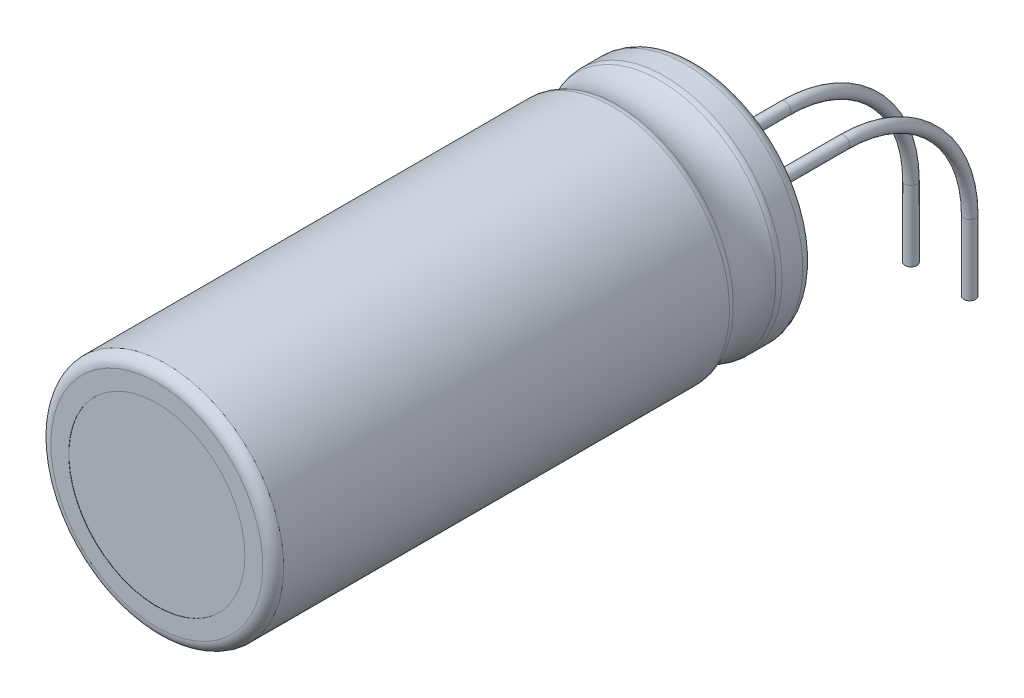
ISO-10303-21;
HEADER;
FILE_DESCRIPTION(('STEP AP214'),'2;1');
FILE_NAME('part.step','',(''),(''),'','','');
FILE_SCHEMA(('AUTOMOTIVE_DESIGN { 1 0 10303 214 1 1 1 1 }'));
ENDSEC;
DATA;
#1=APPLICATION_CONTEXT('core data for automotive mechanical design processes');
#2=APPLICATION_PROTOCOL_DEFINITION('international standard','automotive_design',2000,#1);
#3=PRODUCT_CONTEXT('',#1,'mechanical');
#4=PRODUCT('Part','Part','',(#3));
#5=PRODUCT_RELATED_PRODUCT_CATEGORY('part','',(#4));
#6=PRODUCT_DEFINITION_FORMATION('','',#4);
#7=PRODUCT_DEFINITION_CONTEXT('part definition',#1,'design');
#8=PRODUCT_DEFINITION('design','',#6,#7);
#9=PRODUCT_DEFINITION_SHAPE('','',#8);
#10=(LENGTH_UNIT() NAMED_UNIT(*) SI_UNIT(.MILLI.,.METRE.));
#11=(NAMED_UNIT(*) PLANE_ANGLE_UNIT() SI_UNIT($,.RADIAN.));
#12=(NAMED_UNIT(*) SI_UNIT($,.STERADIAN.) SOLID_ANGLE_UNIT());
#13=UNCERTAINTY_MEASURE_WITH_UNIT(LENGTH_MEASURE(1.E-05),#10,'distance_accuracy_value','');
#14=(GEOMETRIC_REPRESENTATION_CONTEXT(3) GLOBAL_UNCERTAINTY_ASSIGNED_CONTEXT((#13)) GLOBAL_UNIT_ASSIGNED_CONTEXT((#10,
#11,#12)) REPRESENTATION_CONTEXT('',''));
#15=CARTESIAN_POINT('',(0.,0.,0.));
#16=DIRECTION('',(0.,0.,1.));
#17=DIRECTION('',(1.,0.,0.));
#18=AXIS2_PLACEMENT_3D('',#15,#16,#17);
#19=CARTESIAN_POINT('',(0.,0.,23.));
#20=DIRECTION('',(0.,0.,-1.));
#21=DIRECTION('',(-1.,0.,0.));
#22=AXIS2_PLACEMENT_3D('',#19,#20,#21);
#23=CYLINDRICAL_SURFACE('',#22,5.);
#24=DIRECTION('',(0.,0.,1.));
#25=VECTOR('',#24,1.);
#26=CARTESIAN_POINT('',(-4.53153893518325,2.1130913087035,0.));
#27=LINE('',#26,#25);
#28=CARTESIAN_POINT('',(-4.53153893518325,2.1130913087035,0.5));
#29=VERTEX_POINT('',#28);
#30=CARTESIAN_POINT('',(-4.53153893518325,2.1130913087035,1.38196601124914));
#31=VERTEX_POINT('',#30);
#32=EDGE_CURVE('E188',#29,#31,#27,.T.);
#33=ORIENTED_EDGE('',*,*,#32,.T.);
#34=CARTESIAN_POINT('',(0.,0.,1.38196601124914));
#35=DIRECTION('',(0.,0.,1.));
#36=DIRECTION('',(1.,0.,0.));
#37=AXIS2_PLACEMENT_3D('',#34,#35,#36);
#38=CIRCLE('',#37,5.);
#39=CARTESIAN_POINT('',(-4.53153893518325,-2.1130913087035,1.38196601124914));
#40=VERTEX_POINT('',#39);
#41=EDGE_CURVE('E260',#31,#40,#38,.F.);
#42=ORIENTED_EDGE('',*,*,#41,.T.);
#43=DIRECTION('',(0.,0.,1.));
#44=VECTOR('',#43,1.);
#45=CARTESIAN_POINT('',(-4.53153893518325,-2.1130913087035,0.));
#46=LINE('',#45,#44);
#47=CARTESIAN_POINT('',(-4.53153893518325,-2.1130913087035,0.5));
#48=VERTEX_POINT('',#47);
#49=EDGE_CURVE('E200',#48,#40,#46,.T.);
#50=ORIENTED_EDGE('',*,*,#49,.F.);
#51=CARTESIAN_POINT('',(0.,0.,0.5));
#52=DIRECTION('',(0.,0.,1.));
#53=DIRECTION('',(1.,0.,0.));
#54=AXIS2_PLACEMENT_3D('',#51,#52,#53);
#55=CIRCLE('',#54,5.);
#56=EDGE_CURVE('E245',#48,#29,#55,.T.);
#57=ORIENTED_EDGE('',*,*,#56,.T.);
#58=EDGE_LOOP('',(#33,#42,#50,#57));
#59=FACE_BOUND('',#58,.T.);
#60=ADVANCED_FACE('F41',(#59),#23,.T.);
#61=CARTESIAN_POINT('',(0.,0.,0.));
#62=DIRECTION('',(0.,0.,-1.));
#63=DIRECTION('',(-1.,0.,0.));
#64=AXIS2_PLACEMENT_3D('',#61,#62,#63);
#65=CYLINDRICAL_SURFACE('',#64,5.01);
#66=DIRECTION('',(0.,0.,1.));
#67=VECTOR('',#66,1.);
#68=CARTESIAN_POINT('',(-4.54060201305361,2.11731749132091,0.));
#69=LINE('',#68,#67);
#70=CARTESIAN_POINT('',(-4.54060201305361,2.11731749132091,0.5));
#71=VERTEX_POINT('',#70);
#72=CARTESIAN_POINT('',(-4.54060201305361,2.11731749132091,1.40050125628935));
#73=VERTEX_POINT('',#72);
#74=EDGE_CURVE('E187',#71,#73,#69,.T.);
#75=ORIENTED_EDGE('',*,*,#74,.F.);
#76=CARTESIAN_POINT('',(0.,0.,0.5));
#77=DIRECTION('',(0.,0.,1.));
#78=DIRECTION('',(1.,0.,0.));
#79=AXIS2_PLACEMENT_3D('',#76,#77,#78);
#80=CIRCLE('',#79,5.01);
#81=CARTESIAN_POINT('',(-4.54060201305361,-2.11731749132091,0.5));
#82=VERTEX_POINT('',#81);
#83=EDGE_CURVE('E303',#71,#82,#80,.T.);
#84=ORIENTED_EDGE('',*,*,#83,.T.);
#85=DIRECTION('',(0.,0.,1.));
#86=VECTOR('',#85,1.);
#87=CARTESIAN_POINT('',(-4.54060201305361,-2.11731749132091,0.));
#88=LINE('',#87,#86);
#89=CARTESIAN_POINT('',(-4.54060201305361,-2.11731749132091,1.40050125628935));
#90=VERTEX_POINT('',#89);
#91=EDGE_CURVE('E199',#82,#90,#88,.T.);
#92=ORIENTED_EDGE('',*,*,#91,.T.);
#93=CARTESIAN_POINT('',(0.,0.,1.40050125628935));
#94=DIRECTION('',(0.,0.,1.));
#95=DIRECTION('',(1.,0.,0.));
#96=AXIS2_PLACEMENT_3D('',#93,#94,#95);
#97=CIRCLE('',#96,5.01);
#98=EDGE_CURVE('E299',#90,#73,#97,.F.);
#99=ORIENTED_EDGE('',*,*,#98,.T.);
#100=EDGE_LOOP('',(#75,#84,#92,#99));
#101=FACE_BOUND('',#100,.T.);
#102=ADVANCED_FACE('F351',(#101),#65,.T.);
#103=CARTESIAN_POINT('',(0.,0.,0.));
#104=DIRECTION('',(-0.4226182617407,0.90630778703665,0.));
#105=DIRECTION('',(0.,0.,1.));
#106=AXIS2_PLACEMENT_3D('',#103,#104,#105);
#107=PLANE('',#106);
#108=ORIENTED_EDGE('',*,*,#91,.F.);
#109=CARTESIAN_POINT('',(-4.08744811953529,-1.90600836045056,0.5));
#110=DIRECTION('',(-0.4226182617407,0.90630778703665,0.));
#111=DIRECTION('',(-0.90630778703665,-0.4226182617407,0.));
#112=AXIS2_PLACEMENT_3D('',#109,#110,#111);
#113=CIRCLE('',#112,0.5);
#114=CARTESIAN_POINT('',(-4.08744811953529,-1.90600836045056,0.));
#115=VERTEX_POINT('',#114);
#116=EDGE_CURVE('E309',#82,#115,#113,.F.);
#117=ORIENTED_EDGE('',*,*,#116,.T.);
#118=DIRECTION('',(-0.90630778703665,-0.4226182617407,0.));
#119=VECTOR('',#118,1.);
#120=CARTESIAN_POINT('',(-4.53153893518325,-2.1130913087035,0.));
#121=LINE('',#120,#119);
#122=CARTESIAN_POINT('',(-4.07838504166492,-1.90178217783315,0.));
#123=VERTEX_POINT('',#122);
#124=EDGE_CURVE('E192',#123,#115,#121,.T.);
#125=ORIENTED_EDGE('',*,*,#124,.F.);
#126=CARTESIAN_POINT('',(-4.07838504166492,-1.90178217783315,0.5));
#127=DIRECTION('',(-0.4226182617407,0.90630778703665,0.));
#128=DIRECTION('',(-0.90630778703665,-0.4226182617407,0.));
#129=AXIS2_PLACEMENT_3D('',#126,#127,#128);
#130=CIRCLE('',#129,0.5);
#131=EDGE_CURVE('E257',#123,#48,#130,.T.);
#132=ORIENTED_EDGE('',*,*,#131,.T.);
#133=ORIENTED_EDGE('',*,*,#49,.T.);
#134=CARTESIAN_POINT('',(-4.07838504166511,-1.90178217783324,1.38196601124914));
#135=DIRECTION('',(-0.4226182617407,0.90630778703665,0.));
#136=DIRECTION('',(-0.90630778703665,-0.4226182617407,0.));
#137=AXIS2_PLACEMENT_3D('',#134,#135,#136);
#138=CIRCLE('',#137,0.5);
#139=CARTESIAN_POINT('',(-4.48838142151513,-2.09296662957313,1.59492486624938));
#140=VERTEX_POINT('',#139);
#141=EDGE_CURVE('E276',#40,#140,#138,.T.);
#142=ORIENTED_EDGE('',*,*,#141,.T.);
#143=CARTESIAN_POINT('',(-6.23086603587696,-2.90550054946731,2.5));
#144=DIRECTION('',(-0.4226182617407,0.90630778703665,0.));
#145=DIRECTION('',(-0.90630778703665,-0.4226182617407,0.));
#146=AXIS2_PLACEMENT_3D('',#143,#144,#145);
#147=CIRCLE('',#146,2.125);
#148=CARTESIAN_POINT('',(-4.53153893518325,-2.1130913087035,1.5));
#149=VERTEX_POINT('',#148);
#150=EDGE_CURVE('E272',#149,#140,#147,.F.);
#151=ORIENTED_EDGE('',*,*,#150,.F.);
#152=CARTESIAN_POINT('',(-4.08744811953529,-1.90600836045056,1.40050125628935));
#153=DIRECTION('',(-0.4226182617407,0.90630778703665,0.));
#154=DIRECTION('',(-0.90630778703665,-0.4226182617407,0.));
#155=AXIS2_PLACEMENT_3D('',#152,#153,#154);
#156=CIRCLE('',#155,0.5);
#157=EDGE_CURVE('E306',#149,#90,#156,.F.);
#158=ORIENTED_EDGE('',*,*,#157,.T.);
#159=EDGE_LOOP('',(#108,#117,#125,#132,#133,#142,#151,#158));
#160=FACE_BOUND('',#159,.T.);
#161=ADVANCED_FACE('F360',(#160),#107,.F.);
#162=CARTESIAN_POINT('',(0.,0.,0.));
#163=DIRECTION('',(0.4226182617407,0.90630778703665,0.));
#164=DIRECTION('',(0.,0.,1.));
#165=AXIS2_PLACEMENT_3D('',#162,#163,#164);
#166=PLANE('',#165);
#167=DIRECTION('',(-0.90630778703665,0.4226182617407,0.));
#168=VECTOR('',#167,1.);
#169=CARTESIAN_POINT('',(-4.53153893518325,2.1130913087035,0.));
#170=LINE('',#169,#168);
#171=CARTESIAN_POINT('',(-4.07838504166492,1.90178217783315,0.));
#172=VERTEX_POINT('',#171);
#173=CARTESIAN_POINT('',(-4.08744811953529,1.90600836045056,0.));
#174=VERTEX_POINT('',#173);
#175=EDGE_CURVE('E173',#172,#174,#170,.T.);
#176=ORIENTED_EDGE('',*,*,#175,.T.);
#177=CARTESIAN_POINT('',(-4.08744811953529,1.90600836045056,0.5));
#178=DIRECTION('',(0.4226182617407,0.90630778703665,0.));
#179=DIRECTION('',(-0.90630778703665,0.4226182617407,0.));
#180=AXIS2_PLACEMENT_3D('',#177,#178,#179);
#181=CIRCLE('',#180,0.5);
#182=EDGE_CURVE('E296',#174,#71,#181,.T.);
#183=ORIENTED_EDGE('',*,*,#182,.T.);
#184=ORIENTED_EDGE('',*,*,#74,.T.);
#185=CARTESIAN_POINT('',(-4.08744811953529,1.90600836045056,1.40050125628935));
#186=DIRECTION('',(0.4226182617407,0.90630778703665,0.));
#187=DIRECTION('',(-0.90630778703665,0.4226182617407,0.));
#188=AXIS2_PLACEMENT_3D('',#185,#186,#187);
#189=CIRCLE('',#188,0.5);
#190=CARTESIAN_POINT('',(-4.53153893518324,2.1130913087035,1.5));
#191=VERTEX_POINT('',#190);
#192=EDGE_CURVE('E293',#73,#191,#189,.T.);
#193=ORIENTED_EDGE('',*,*,#192,.T.);
#194=CARTESIAN_POINT('',(-6.23086603587696,2.90550054946731,2.5));
#195=DIRECTION('',(0.4226182617407,0.90630778703665,0.));
#196=DIRECTION('',(-0.90630778703665,0.4226182617407,0.));
#197=AXIS2_PLACEMENT_3D('',#194,#195,#196);
#198=CIRCLE('',#197,2.125);
#199=CARTESIAN_POINT('',(-4.48838142151513,2.09296662957313,1.59492486624938));
#200=VERTEX_POINT('',#199);
#201=EDGE_CURVE('E264',#200,#191,#198,.T.);
#202=ORIENTED_EDGE('',*,*,#201,.F.);
#203=CARTESIAN_POINT('',(-4.07838504166511,1.90178217783324,1.38196601124914));
#204=DIRECTION('',(0.4226182617407,0.90630778703665,0.));
#205=DIRECTION('',(-0.90630778703665,0.4226182617407,0.));
#206=AXIS2_PLACEMENT_3D('',#203,#204,#205);
#207=CIRCLE('',#206,0.5);
#208=EDGE_CURVE('E279',#200,#31,#207,.F.);
#209=ORIENTED_EDGE('',*,*,#208,.T.);
#210=ORIENTED_EDGE('',*,*,#32,.F.);
#211=CARTESIAN_POINT('',(-4.07838504166492,1.90178217783315,0.5));
#212=DIRECTION('',(0.4226182617407,0.90630778703665,0.));
#213=DIRECTION('',(-0.90630778703665,0.4226182617407,0.));
#214=AXIS2_PLACEMENT_3D('',#211,#212,#213);
#215=CIRCLE('',#214,0.5);
#216=EDGE_CURVE('E253',#29,#172,#215,.F.);
#217=ORIENTED_EDGE('',*,*,#216,.T.);
#218=EDGE_LOOP('',(#176,#183,#184,#193,#202,#209,#210,#217));
#219=FACE_BOUND('',#218,.T.);
#220=ADVANCED_FACE('F348',(#219),#166,.T.);
#221=CARTESIAN_POINT('',(0.,0.,0.));
#222=DIRECTION('',(0.,0.,1.));
#223=DIRECTION('',(1.,0.,0.));
#224=AXIS2_PLACEMENT_3D('',#221,#222,#223);
#225=PLANE('',#224);
#226=CARTESIAN_POINT('',(-1.25,0.,0.));
#227=DIRECTION('',(0.,0.,1.));
#228=DIRECTION('',(1.,0.,0.));
#229=AXIS2_PLACEMENT_3D('',#226,#227,#228);
#230=CIRCLE('',#229,0.25);
#231=CARTESIAN_POINT('',(-1.,0.,0.));
#232=VERTEX_POINT('',#231);
#233=EDGE_CURVE('E241',#232,#232,#230,.F.);
#234=ORIENTED_EDGE('',*,*,#233,.F.);
#235=EDGE_LOOP('',(#234));
#236=FACE_BOUND('',#235,.T.);
#237=CARTESIAN_POINT('',(1.25,0.,0.));
#238=DIRECTION('',(0.,0.,1.));
#239=DIRECTION('',(1.,0.,0.));
#240=AXIS2_PLACEMENT_3D('',#237,#238,#239);
#241=CIRCLE('',#240,0.25);
#242=CARTESIAN_POINT('',(1.5,0.,0.));
#243=VERTEX_POINT('',#242);
#244=EDGE_CURVE('E237',#243,#243,#241,.F.);
#245=ORIENTED_EDGE('',*,*,#244,.F.);
#246=EDGE_LOOP('',(#245));
#247=FACE_BOUND('',#246,.T.);
#248=ORIENTED_EDGE('',*,*,#124,.T.);
#249=CARTESIAN_POINT('',(0.,0.,0.));
#250=DIRECTION('',(0.,0.,1.));
#251=DIRECTION('',(1.,0.,0.));
#252=AXIS2_PLACEMENT_3D('',#249,#250,#251);
#253=CIRCLE('',#252,4.51);
#254=EDGE_CURVE('E289',#115,#174,#253,.F.);
#255=ORIENTED_EDGE('',*,*,#254,.T.);
#256=ORIENTED_EDGE('',*,*,#175,.F.);
#257=CARTESIAN_POINT('',(0.,0.,0.));
#258=DIRECTION('',(0.,0.,1.));
#259=DIRECTION('',(1.,0.,0.));
#260=AXIS2_PLACEMENT_3D('',#257,#258,#259);
#261=CIRCLE('',#260,4.5);
#262=EDGE_CURVE('E249',#172,#123,#261,.F.);
#263=ORIENTED_EDGE('',*,*,#262,.T.);
#264=EDGE_LOOP('',(#248,#255,#256,#263));
#265=FACE_BOUND('',#264,.T.);
#266=ADVANCED_FACE('F362',(#236,#247,#265),#225,.F.);
#267=CARTESIAN_POINT('',(1.25,0.,-5.));
#268=DIRECTION('',(0.,0.,1.));
#269=DIRECTION('',(1.,0.,0.));
#270=AXIS2_PLACEMENT_3D('',#267,#268,#269);
#271=CYLINDRICAL_SURFACE('',#270,0.25);
#272=CARTESIAN_POINT('',(1.25,0.,-5.));
#273=DIRECTION('',(0.,0.,-1.));
#274=DIRECTION('',(-1.,0.,0.));
#275=AXIS2_PLACEMENT_3D('',#272,#273,#274);
#276=CIRCLE('',#275,0.25);
#277=CARTESIAN_POINT('',(1.25,0.25,-5.));
#278=VERTEX_POINT('',#277);
#279=EDGE_CURVE('E233',#278,#278,#276,.T.);
#280=ORIENTED_EDGE('',*,*,#279,.F.);
#281=EDGE_LOOP('',(#280));
#282=FACE_BOUND('',#281,.T.);
#283=ORIENTED_EDGE('',*,*,#244,.T.);
#284=EDGE_LOOP('',(#283));
#285=FACE_BOUND('',#284,.T.);
#286=ADVANCED_FACE('F446',(#282,#285),#271,.T.);
#287=CARTESIAN_POINT('',(-1.25,0.,-5.));
#288=DIRECTION('',(0.,0.,1.));
#289=DIRECTION('',(1.,0.,0.));
#290=AXIS2_PLACEMENT_3D('',#287,#288,#289);
#291=CYLINDRICAL_SURFACE('',#290,0.25);
#292=CARTESIAN_POINT('',(-1.25,0.,-5.));
#293=DIRECTION('',(0.,0.,-1.));
#294=DIRECTION('',(-1.,0.,0.));
#295=AXIS2_PLACEMENT_3D('',#292,#293,#294);
#296=CIRCLE('',#295,0.25);
#297=CARTESIAN_POINT('',(-1.25,0.25,-5.));
#298=VERTEX_POINT('',#297);
#299=EDGE_CURVE('E229',#298,#298,#296,.T.);
#300=ORIENTED_EDGE('',*,*,#299,.F.);
#301=EDGE_LOOP('',(#300));
#302=FACE_BOUND('',#301,.T.);
#303=ORIENTED_EDGE('',*,*,#233,.T.);
#304=EDGE_LOOP('',(#303));
#305=FACE_BOUND('',#304,.T.);
#306=ADVANCED_FACE('F442',(#302,#305),#291,.T.);
#307=CARTESIAN_POINT('',(1.25,-5.35829573508783,-5.));
#308=DIRECTION('',(1.,0.,0.));
#309=DIRECTION('',(0.,0.,-1.));
#310=AXIS2_PLACEMENT_3D('',#307,#308,#309);
#311=TOROIDAL_SURFACE('',#310,5.35829573508783,0.25);
#312=CARTESIAN_POINT('',(1.25,-5.35829573508785,-10.3582957350878));
#313=DIRECTION('',(0.,-1.,0.));
#314=DIRECTION('',(-1.,0.,0.));
#315=AXIS2_PLACEMENT_3D('',#312,#313,#314);
#316=CIRCLE('',#315,0.25);
#317=CARTESIAN_POINT('',(1.25,-5.35829573508785,-10.6082957350878));
#318=VERTEX_POINT('',#317);
#319=EDGE_CURVE('E225',#318,#318,#316,.T.);
#320=CARTESIAN_POINT('',(1.25,-5.35829573508783,-5.));
#321=DIRECTION('',(1.,0.,0.));
#322=DIRECTION('',(0.,0.,-1.));
#323=AXIS2_PLACEMENT_3D('',#320,#321,#322);
#324=CIRCLE('',#323,5.60829573508783);
#325=EDGE_CURVE('',#318,#278,#324,.T.);
#326=ORIENTED_EDGE('',*,*,#319,.F.);
#327=ORIENTED_EDGE('',*,*,#279,.T.);
#328=ORIENTED_EDGE('',*,*,#325,.T.);
#329=ORIENTED_EDGE('',*,*,#325,.F.);
#330=EDGE_LOOP('',(#326,#328,#327,#329));
#331=FACE_BOUND('',#330,.T.);
#332=ADVANCED_FACE('F438',(#331),#311,.T.);
#333=CARTESIAN_POINT('',(-1.25,-5.35829573508783,-5.));
#334=DIRECTION('',(1.,0.,0.));
#335=DIRECTION('',(0.,0.,-1.));
#336=AXIS2_PLACEMENT_3D('',#333,#334,#335);
#337=TOROIDAL_SURFACE('',#336,5.35829573508783,0.25);
#338=CARTESIAN_POINT('',(-1.25,-5.35829573508785,-10.3582957350878));
#339=DIRECTION('',(0.,-1.,0.));
#340=DIRECTION('',(-1.,0.,0.));
#341=AXIS2_PLACEMENT_3D('',#338,#339,#340);
#342=CIRCLE('',#341,0.25);
#343=CARTESIAN_POINT('',(-1.25,-5.35829573508785,-10.6082957350878));
#344=VERTEX_POINT('',#343);
#345=EDGE_CURVE('E221',#344,#344,#342,.T.);
#346=CARTESIAN_POINT('',(-1.25,-5.35829573508783,-5.));
#347=DIRECTION('',(1.,0.,0.));
#348=DIRECTION('',(0.,0.,-1.));
#349=AXIS2_PLACEMENT_3D('',#346,#347,#348);
#350=CIRCLE('',#349,5.60829573508783);
#351=EDGE_CURVE('',#344,#298,#350,.T.);
#352=ORIENTED_EDGE('',*,*,#345,.F.);
#353=ORIENTED_EDGE('',*,*,#299,.T.);
#354=ORIENTED_EDGE('',*,*,#351,.T.);
#355=ORIENTED_EDGE('',*,*,#351,.F.);
#356=EDGE_LOOP('',(#352,#354,#353,#355));
#357=FACE_BOUND('',#356,.T.);
#358=ADVANCED_FACE('F434',(#357),#337,.T.);
#359=CARTESIAN_POINT('',(1.25,-8.35829573508785,-10.3582957350878));
#360=DIRECTION('',(0.,1.,0.));
#361=DIRECTION('',(0.,0.,1.));
#362=AXIS2_PLACEMENT_3D('',#359,#360,#361);
#363=CYLINDRICAL_SURFACE('',#362,0.25);
#364=CARTESIAN_POINT('',(1.25,-8.35829573508785,-10.3582957350878));
#365=DIRECTION('',(0.,-1.,0.));
#366=DIRECTION('',(0.,0.,-1.));
#367=AXIS2_PLACEMENT_3D('',#364,#365,#366);
#368=CIRCLE('',#367,0.25);
#369=CARTESIAN_POINT('',(1.25,-8.35829573508785,-10.6082957350878));
#370=VERTEX_POINT('',#369);
#371=EDGE_CURVE('E217',#370,#370,#368,.T.);
#372=ORIENTED_EDGE('',*,*,#371,.F.);
#373=EDGE_LOOP('',(#372));
#374=FACE_BOUND('',#373,.T.);
#375=ORIENTED_EDGE('',*,*,#319,.T.);
#376=EDGE_LOOP('',(#375));
#377=FACE_BOUND('',#376,.T.);
#378=ADVANCED_FACE('F430',(#374,#377),#363,.T.);
#379=CARTESIAN_POINT('',(1.25,-8.35829573508785,-10.3582957350878));
#380=DIRECTION('',(0.,-1.,0.));
#381=DIRECTION('',(0.,0.,-1.));
#382=AXIS2_PLACEMENT_3D('',#379,#380,#381);
#383=PLANE('',#382);
#384=ORIENTED_EDGE('',*,*,#371,.T.);
#385=EDGE_LOOP('',(#384));
#386=FACE_BOUND('',#385,.T.);
#387=ADVANCED_FACE('F426',(#386),#383,.T.);
#388=CARTESIAN_POINT('',(-1.25,-8.35829573508785,-10.3582957350878));
#389=DIRECTION('',(0.,1.,0.));
#390=DIRECTION('',(0.,0.,1.));
#391=AXIS2_PLACEMENT_3D('',#388,#389,#390);
#392=CYLINDRICAL_SURFACE('',#391,0.25);
#393=CARTESIAN_POINT('',(-1.25,-8.35829573508785,-10.3582957350878));
#394=DIRECTION('',(0.,-1.,0.));
#395=DIRECTION('',(0.,0.,-1.));
#396=AXIS2_PLACEMENT_3D('',#393,#394,#395);
#397=CIRCLE('',#396,0.25);
#398=CARTESIAN_POINT('',(-1.25,-8.35829573508785,-10.6082957350878));
#399=VERTEX_POINT('',#398);
#400=EDGE_CURVE('E210',#399,#399,#397,.T.);
#401=ORIENTED_EDGE('',*,*,#400,.F.);
#402=EDGE_LOOP('',(#401));
#403=FACE_BOUND('',#402,.T.);
#404=ORIENTED_EDGE('',*,*,#345,.T.);
#405=EDGE_LOOP('',(#404));
#406=FACE_BOUND('',#405,.T.);
#407=ADVANCED_FACE('F422',(#403,#406),#392,.T.);
#408=CARTESIAN_POINT('',(-1.25,-8.35829573508785,-10.3582957350878));
#409=DIRECTION('',(0.,-1.,0.));
#410=DIRECTION('',(0.,0.,-1.));
#411=AXIS2_PLACEMENT_3D('',#408,#409,#410);
#412=PLANE('',#411);
#413=ORIENTED_EDGE('',*,*,#400,.T.);
#414=EDGE_LOOP('',(#413));
#415=FACE_BOUND('',#414,.T.);
#416=ADVANCED_FACE('F419',(#415),#412,.T.);
#417=CARTESIAN_POINT('',(0.,0.,2.5));
#418=DIRECTION('',(0.,0.,-1.));
#419=DIRECTION('',(-1.,0.,0.));
#420=AXIS2_PLACEMENT_3D('',#417,#418,#419);
#421=TOROIDAL_SURFACE('',#420,6.875,2.125);
#422=CARTESIAN_POINT('',(0.,0.,1.5));
#423=DIRECTION('',(0.,0.,-1.));
#424=DIRECTION('',(-1.,0.,0.));
#425=AXIS2_PLACEMENT_3D('',#422,#423,#424);
#426=CIRCLE('',#425,5.);
#427=EDGE_CURVE('E174',#149,#191,#426,.T.);
#428=ORIENTED_EDGE('',*,*,#427,.F.);
#429=ORIENTED_EDGE('',*,*,#150,.T.);
#430=CARTESIAN_POINT('',(0.,0.,1.59492486624938));
#431=DIRECTION('',(0.,0.,1.));
#432=DIRECTION('',(1.,0.,0.));
#433=AXIS2_PLACEMENT_3D('',#430,#431,#432);
#434=CIRCLE('',#433,4.95238095238128);
#435=EDGE_CURVE('E268',#140,#200,#434,.T.);
#436=ORIENTED_EDGE('',*,*,#435,.T.);
#437=ORIENTED_EDGE('',*,*,#201,.T.);
#438=EDGE_LOOP('',(#428,#429,#436,#437));
#439=FACE_BOUND('',#438,.T.);
#440=CARTESIAN_POINT('',(0.,0.,3.40507513375061));
#441=DIRECTION('',(0.,0.,-1.));
#442=DIRECTION('',(-1.,0.,0.));
#443=AXIS2_PLACEMENT_3D('',#440,#441,#442);
#444=CIRCLE('',#443,4.95238095238128);
#445=CARTESIAN_POINT('',(-4.48838142151513,2.09296662957313,3.40507513375061));
#446=VERTEX_POINT('',#445);
#447=CARTESIAN_POINT('',(-4.48838142151513,-2.09296662957313,3.40507513375061));
#448=VERTEX_POINT('',#447);
#449=EDGE_CURVE('E167',#446,#448,#444,.T.);
#450=ORIENTED_EDGE('',*,*,#449,.T.);
#451=CARTESIAN_POINT('',(-6.23086603587696,-2.90550054946731,2.5));
#452=DIRECTION('',(-0.4226182617407,0.90630778703665,0.));
#453=DIRECTION('',(-0.90630778703665,-0.4226182617407,0.));
#454=AXIS2_PLACEMENT_3D('',#451,#452,#453);
#455=CIRCLE('',#454,2.125);
#456=CARTESIAN_POINT('',(-4.53153893518325,-2.1130913087035,3.5));
#457=VERTEX_POINT('',#456);
#458=EDGE_CURVE('E148',#448,#457,#455,.F.);
#459=ORIENTED_EDGE('',*,*,#458,.T.);
#460=CARTESIAN_POINT('',(0.,0.,3.5));
#461=DIRECTION('',(0.,0.,-1.));
#462=DIRECTION('',(-1.,0.,0.));
#463=AXIS2_PLACEMENT_3D('',#460,#461,#462);
#464=CIRCLE('',#463,5.);
#465=CARTESIAN_POINT('',(-4.53153893518325,2.1130913087035,3.5));
#466=VERTEX_POINT('',#465);
#467=EDGE_CURVE('E164',#457,#466,#464,.T.);
#468=ORIENTED_EDGE('',*,*,#467,.T.);
#469=CARTESIAN_POINT('',(-6.23086603587696,2.90550054946731,2.5));
#470=DIRECTION('',(0.4226182617407,0.90630778703665,0.));
#471=DIRECTION('',(-0.90630778703665,0.4226182617407,0.));
#472=AXIS2_PLACEMENT_3D('',#469,#470,#471);
#473=CIRCLE('',#472,2.125);
#474=EDGE_CURVE('E282',#466,#446,#473,.T.);
#475=ORIENTED_EDGE('',*,*,#474,.T.);
#476=EDGE_LOOP('',(#450,#459,#468,#475));
#477=FACE_BOUND('',#476,.T.);
#478=ADVANCED_FACE('F162',(#439,#477),#421,.F.);
#479=CARTESIAN_POINT('',(0.,0.,22.99));
#480=DIRECTION('',(0.,0.,1.));
#481=DIRECTION('',(1.,0.,0.));
#482=AXIS2_PLACEMENT_3D('',#479,#480,#481);
#483=PLANE('',#482);
#484=CARTESIAN_POINT('',(0.,0.,22.99));
#485=DIRECTION('',(0.,0.,1.));
#486=DIRECTION('',(1.,0.,0.));
#487=AXIS2_PLACEMENT_3D('',#484,#485,#486);
#488=CIRCLE('',#487,3.75);
#489=CARTESIAN_POINT('',(3.75,0.,22.99));
#490=VERTEX_POINT('',#489);
#491=EDGE_CURVE('E206',#490,#490,#488,.T.);
#492=ORIENTED_EDGE('',*,*,#491,.T.);
#493=EDGE_LOOP('',(#492));
#494=FACE_BOUND('',#493,.T.);
#495=ADVANCED_FACE('F410',(#494),#483,.T.);
#496=CARTESIAN_POINT('',(0.,0.,22.99));
#497=DIRECTION('',(0.,0.,1.));
#498=DIRECTION('',(1.,0.,0.));
#499=AXIS2_PLACEMENT_3D('',#496,#497,#498);
#500=CYLINDRICAL_SURFACE('',#499,3.75);
#501=CARTESIAN_POINT('',(0.,0.,23.));
#502=DIRECTION('',(0.,0.,1.));
#503=DIRECTION('',(1.,0.,0.));
#504=AXIS2_PLACEMENT_3D('',#501,#502,#503);
#505=CIRCLE('',#504,3.75);
#506=CARTESIAN_POINT('',(3.75,0.,23.));
#507=VERTEX_POINT('',#506);
#508=EDGE_CURVE('E204',#507,#507,#505,.T.);
#509=CARTESIAN_POINT('',(3.75,0.,22.99));
#510=CARTESIAN_POINT('',(3.75,0.,22.9901041666667));
#511=CARTESIAN_POINT('',(3.75,0.,22.9902083333333));
#512=CARTESIAN_POINT('',(3.75,0.,22.9904166666667));
#513=CARTESIAN_POINT('',(3.75,0.,22.9905208333333));
#514=CARTESIAN_POINT('',(3.75,0.,22.9907291666667));
#515=CARTESIAN_POINT('',(3.75,0.,22.9908333333333));
#516=CARTESIAN_POINT('',(3.75,0.,22.9910416666667));
#517=CARTESIAN_POINT('',(3.75,0.,22.9911458333333));
#518=CARTESIAN_POINT('',(3.75,0.,22.9913541666667));
#519=CARTESIAN_POINT('',(3.75,0.,22.9914583333333));
#520=CARTESIAN_POINT('',(3.75,0.,22.9916666666667));
#521=CARTESIAN_POINT('',(3.75,0.,22.9917708333333));
#522=CARTESIAN_POINT('',(3.75,0.,22.9919791666667));
#523=CARTESIAN_POINT('',(3.75,0.,22.9920833333333));
#524=CARTESIAN_POINT('',(3.75,0.,22.9922916666667));
#525=CARTESIAN_POINT('',(3.75,0.,22.9923958333333));
#526=CARTESIAN_POINT('',(3.75,0.,22.9926041666667));
#527=CARTESIAN_POINT('',(3.75,0.,22.9927083333333));
#528=CARTESIAN_POINT('',(3.75,0.,22.9929166666667));
#529=CARTESIAN_POINT('',(3.75,0.,22.9930208333333));
#530=CARTESIAN_POINT('',(3.75,0.,22.9932291666667));
#531=CARTESIAN_POINT('',(3.75,0.,22.9933333333333));
#532=CARTESIAN_POINT('',(3.75,0.,22.9935416666667));
#533=CARTESIAN_POINT('',(3.75,0.,22.9936458333333));
#534=CARTESIAN_POINT('',(3.75,0.,22.9938541666667));
#535=CARTESIAN_POINT('',(3.75,0.,22.9939583333333));
#536=CARTESIAN_POINT('',(3.75,0.,22.9941666666667));
#537=CARTESIAN_POINT('',(3.75,0.,22.9942708333333));
#538=CARTESIAN_POINT('',(3.75,0.,22.9944791666667));
#539=CARTESIAN_POINT('',(3.75,0.,22.9945833333333));
#540=CARTESIAN_POINT('',(3.75,0.,22.9947916666667));
#541=CARTESIAN_POINT('',(3.75,0.,22.9948958333333));
#542=CARTESIAN_POINT('',(3.75,0.,22.9951041666667));
#543=CARTESIAN_POINT('',(3.75,0.,22.9952083333333));
#544=CARTESIAN_POINT('',(3.75,0.,22.9954166666667));
#545=CARTESIAN_POINT('',(3.75,0.,22.9955208333333));
#546=CARTESIAN_POINT('',(3.75,0.,22.9957291666667));
#547=CARTESIAN_POINT('',(3.75,0.,22.9958333333333));
#548=CARTESIAN_POINT('',(3.75,0.,22.9960416666667));
#549=CARTESIAN_POINT('',(3.75,0.,22.9961458333333));
#550=CARTESIAN_POINT('',(3.75,0.,22.9963541666667));
#551=CARTESIAN_POINT('',(3.75,0.,22.9964583333333));
#552=CARTESIAN_POINT('',(3.75,0.,22.9966666666667));
#553=CARTESIAN_POINT('',(3.75,0.,22.9967708333333));
#554=CARTESIAN_POINT('',(3.75,0.,22.9969791666667));
#555=CARTESIAN_POINT('',(3.75,0.,22.9970833333333));
#556=CARTESIAN_POINT('',(3.75,0.,22.9972916666667));
#557=CARTESIAN_POINT('',(3.75,0.,22.9973958333333));
#558=CARTESIAN_POINT('',(3.75,0.,22.9976041666667));
#559=CARTESIAN_POINT('',(3.75,0.,22.9977083333333));
#560=CARTESIAN_POINT('',(3.75,0.,22.9979166666667));
#561=CARTESIAN_POINT('',(3.75,0.,22.9980208333333));
#562=CARTESIAN_POINT('',(3.75,0.,22.9982291666667));
#563=CARTESIAN_POINT('',(3.75,0.,22.9983333333333));
#564=CARTESIAN_POINT('',(3.75,0.,22.9985416666667));
#565=CARTESIAN_POINT('',(3.75,0.,22.9986458333333));
#566=CARTESIAN_POINT('',(3.75,0.,22.9988541666667));
#567=CARTESIAN_POINT('',(3.75,0.,22.9989583333333));
#568=CARTESIAN_POINT('',(3.75,0.,22.9991666666667));
#569=CARTESIAN_POINT('',(3.75,0.,22.9992708333333));
#570=CARTESIAN_POINT('',(3.75,0.,22.9994791666667));
#571=CARTESIAN_POINT('',(3.75,0.,22.9995833333333));
#572=CARTESIAN_POINT('',(3.75,0.,22.9997916666667));
#573=CARTESIAN_POINT('',(3.75,0.,22.9998958333333));
#574=CARTESIAN_POINT('',(3.75,0.,23.));
#575=B_SPLINE_CURVE_WITH_KNOTS('',3,(#509,#510,#511,#512,#513,#514,#515,#516,#517,#518,#519,
#520,#521,#522,#523,#524,#525,#526,#527,#528,#529,#530,#531,#532,#533,#534,#535,#536,#537,#538,
#539,#540,#541,#542,#543,#544,#545,#546,#547,#548,#549,#550,#551,#552,#553,#554,#555,#556,#557,
#558,#559,#560,#561,#562,#563,#564,#565,#566,#567,#568,#569,#570,#571,#572,#573,#574),
.UNSPECIFIED.,.F.,.F.,(4,2,2,2,2,2,2,2,2,2,2,2,2,2,2,2,2,2,2,2,2,2,2,2,2,2,2,2,2,2,2,2,4),(0.,
0.000312500000002047,0.000625000000000625,0.000937500000002672,0.00125000000000125,
0.0015625000000033,0.00187500000000188,0.00218750000000045,0.0025000000000025,
0.00281250000000108,0.00312500000000313,0.0034375000000017,0.00375000000000028,
0.00406250000000233,0.00437500000000091,0.00468750000000295,0.00500000000000153,
0.00531250000000011,0.00562500000000216,0.00593750000000073,0.00625000000000278,
0.00656250000000136,0.00687499999999994,0.00718750000000198,0.00750000000000056,
0.00781250000000261,0.00812500000000119,0.00843749999999976,0.00875000000000181,
0.00906250000000039,0.00937500000000244,0.00968750000000101,0.00999999999999959),.UNSPECIFIED.);
#576=EDGE_CURVE('BSEAM413',#490,#507,#575,.T.);
#577=ORIENTED_EDGE('',*,*,#491,.F.);
#578=ORIENTED_EDGE('',*,*,#508,.T.);
#579=ORIENTED_EDGE('',*,*,#576,.T.);
#580=ORIENTED_EDGE('',*,*,#576,.F.);
#581=EDGE_LOOP('',(#577,#579,#578,#580));
#582=FACE_BOUND('',#581,.T.);
#583=ADVANCED_FACE('F413',(#582),#500,.F.);
#584=CARTESIAN_POINT('',(0.,0.,23.));
#585=DIRECTION('',(0.,0.,1.));
#586=DIRECTION('',(1.,0.,0.));
#587=AXIS2_PLACEMENT_3D('',#584,#585,#586);
#588=PLANE('',#587);
#589=CARTESIAN_POINT('',(0.,0.,23.));
#590=DIRECTION('',(0.,0.,1.));
#591=DIRECTION('',(1.,0.,0.));
#592=AXIS2_PLACEMENT_3D('',#589,#590,#591);
#593=CIRCLE('',#592,4.51);
#594=CARTESIAN_POINT('',(-4.08744811953528,-1.90600836045056,23.));
#595=VERTEX_POINT('',#594);
#596=EDGE_CURVE('E11',#595,#595,#593,.T.);
#597=ORIENTED_EDGE('',*,*,#596,.T.);
#598=EDGE_LOOP('',(#597));
#599=FACE_BOUND('',#598,.T.);
#600=ORIENTED_EDGE('',*,*,#508,.F.);
#601=EDGE_LOOP('',(#600));
#602=FACE_BOUND('',#601,.T.);
#603=ADVANCED_FACE('F417',(#599,#602),#588,.T.);
#604=CARTESIAN_POINT('',(-4.53153893518325,-2.1130913087035,3.61803398875085));
#605=VERTEX_POINT('',#604);
#606=CARTESIAN_POINT('',(-4.53153893518324,-2.1130913087035,22.5994987437107));
#607=VERTEX_POINT('',#606);
#608=EDGE_CURVE('E205',#605,#607,#46,.T.);
#609=ORIENTED_EDGE('',*,*,#608,.T.);
#610=CARTESIAN_POINT('',(-4.08744811953529,-1.90600836045056,22.5));
#611=DIRECTION('',(-0.4226182617407,0.90630778703665,0.));
#612=DIRECTION('',(-0.90630778703665,-0.4226182617407,0.));
#613=AXIS2_PLACEMENT_3D('',#610,#611,#612);
#614=CIRCLE('',#613,0.5);
#615=CARTESIAN_POINT('',(-4.54060201305361,-2.11731749132091,22.5));
#616=VERTEX_POINT('',#615);
#617=EDGE_CURVE('E50',#607,#616,#614,.F.);
#618=ORIENTED_EDGE('',*,*,#617,.T.);
#619=CARTESIAN_POINT('',(-4.54060201305361,-2.11731749132091,3.59949874371065));
#620=VERTEX_POINT('',#619);
#621=EDGE_CURVE('E151',#620,#616,#88,.T.);
#622=ORIENTED_EDGE('',*,*,#621,.F.);
#623=CARTESIAN_POINT('',(-4.08744811953529,-1.90600836045056,3.59949874371065));
#624=DIRECTION('',(-0.4226182617407,0.90630778703665,0.));
#625=DIRECTION('',(-0.90630778703665,-0.4226182617407,0.));
#626=AXIS2_PLACEMENT_3D('',#623,#624,#625);
#627=CIRCLE('',#626,0.5);
#628=EDGE_CURVE('E145',#620,#457,#627,.F.);
#629=ORIENTED_EDGE('',*,*,#628,.T.);
#630=ORIENTED_EDGE('',*,*,#458,.F.);
#631=CARTESIAN_POINT('',(-4.07838504166511,-1.90178217783324,3.61803398875085));
#632=DIRECTION('',(-0.4226182617407,0.90630778703665,0.));
#633=DIRECTION('',(-0.90630778703665,-0.4226182617407,0.));
#634=AXIS2_PLACEMENT_3D('',#631,#632,#633);
#635=CIRCLE('',#634,0.5);
#636=EDGE_CURVE('E316',#448,#605,#635,.T.);
#637=ORIENTED_EDGE('',*,*,#636,.T.);
#638=EDGE_LOOP('',(#609,#618,#622,#629,#630,#637));
#639=FACE_BOUND('',#638,.T.);
#640=ADVANCED_FACE('F147',(#639),#107,.F.);
#641=CARTESIAN_POINT('',(-4.54060201305361,2.11731749132091,3.59949874371065));
#642=VERTEX_POINT('',#641);
#643=CARTESIAN_POINT('',(-4.54060201305361,2.11731749132091,22.5));
#644=VERTEX_POINT('',#643);
#645=EDGE_CURVE('E179',#642,#644,#69,.T.);
#646=ORIENTED_EDGE('',*,*,#645,.T.);
#647=CARTESIAN_POINT('',(-4.08744811953529,1.90600836045056,22.5));
#648=DIRECTION('',(0.4226182617407,0.90630778703665,0.));
#649=DIRECTION('',(-0.90630778703665,0.4226182617407,0.));
#650=AXIS2_PLACEMENT_3D('',#647,#648,#649);
#651=CIRCLE('',#650,0.5);
#652=CARTESIAN_POINT('',(-4.53153893518324,2.1130913087035,22.5994987437107));
#653=VERTEX_POINT('',#652);
#654=EDGE_CURVE('E326',#644,#653,#651,.T.);
#655=ORIENTED_EDGE('',*,*,#654,.T.);
#656=CARTESIAN_POINT('',(-4.53153893518325,2.1130913087035,3.61803398875085));
#657=VERTEX_POINT('',#656);
#658=EDGE_CURVE('E193',#657,#653,#27,.T.);
#659=ORIENTED_EDGE('',*,*,#658,.F.);
#660=CARTESIAN_POINT('',(-4.07838504166511,1.90178217783324,3.61803398875085));
#661=DIRECTION('',(0.4226182617407,0.90630778703665,0.));
#662=DIRECTION('',(-0.90630778703665,0.4226182617407,0.));
#663=AXIS2_PLACEMENT_3D('',#660,#661,#662);
#664=CIRCLE('',#663,0.5);
#665=EDGE_CURVE('E319',#657,#446,#664,.F.);
#666=ORIENTED_EDGE('',*,*,#665,.T.);
#667=ORIENTED_EDGE('',*,*,#474,.F.);
#668=CARTESIAN_POINT('',(-4.08744811953529,1.90600836045056,3.59949874371065));
#669=DIRECTION('',(0.4226182617407,0.90630778703665,0.));
#670=DIRECTION('',(-0.90630778703665,0.4226182617407,0.));
#671=AXIS2_PLACEMENT_3D('',#668,#669,#670);
#672=CIRCLE('',#671,0.5);
#673=EDGE_CURVE('E157',#466,#642,#672,.T.);
#674=ORIENTED_EDGE('',*,*,#673,.T.);
#675=EDGE_LOOP('',(#646,#655,#659,#666,#667,#674));
#676=FACE_BOUND('',#675,.T.);
#677=ADVANCED_FACE('F339',(#676),#166,.T.);
#678=ORIENTED_EDGE('',*,*,#621,.T.);
#679=CARTESIAN_POINT('',(0.,0.,22.5));
#680=DIRECTION('',(0.,0.,1.));
#681=DIRECTION('',(1.,0.,0.));
#682=AXIS2_PLACEMENT_3D('',#679,#680,#681);
#683=CIRCLE('',#682,5.01);
#684=EDGE_CURVE('E322',#616,#644,#683,.F.);
#685=ORIENTED_EDGE('',*,*,#684,.T.);
#686=ORIENTED_EDGE('',*,*,#645,.F.);
#687=CARTESIAN_POINT('',(0.,0.,3.59949874371065));
#688=DIRECTION('',(0.,0.,-1.));
#689=DIRECTION('',(-1.,0.,0.));
#690=AXIS2_PLACEMENT_3D('',#687,#688,#689);
#691=CIRCLE('',#690,5.01);
#692=EDGE_CURVE('E158',#642,#620,#691,.F.);
#693=ORIENTED_EDGE('',*,*,#692,.T.);
#694=EDGE_LOOP('',(#678,#685,#686,#693));
#695=FACE_BOUND('',#694,.T.);
#696=ADVANCED_FACE('F335',(#695),#65,.T.);
#697=ORIENTED_EDGE('',*,*,#658,.T.);
#698=CARTESIAN_POINT('',(0.,0.,22.5994987437107));
#699=DIRECTION('',(0.,0.,-1.));
#700=DIRECTION('',(-1.,0.,0.));
#701=AXIS2_PLACEMENT_3D('',#698,#699,#700);
#702=CIRCLE('',#701,5.);
#703=EDGE_CURVE('E60',#653,#607,#702,.T.);
#704=ORIENTED_EDGE('',*,*,#703,.T.);
#705=ORIENTED_EDGE('',*,*,#608,.F.);
#706=CARTESIAN_POINT('',(0.,0.,3.61803398875085));
#707=DIRECTION('',(0.,0.,1.));
#708=DIRECTION('',(1.,0.,0.));
#709=AXIS2_PLACEMENT_3D('',#706,#707,#708);
#710=CIRCLE('',#709,5.);
#711=EDGE_CURVE('E169',#605,#657,#710,.T.);
#712=ORIENTED_EDGE('',*,*,#711,.T.);
#713=EDGE_LOOP('',(#697,#704,#705,#712));
#714=FACE_BOUND('',#713,.T.);
#715=ADVANCED_FACE('F341',(#714),#23,.T.);
#716=CARTESIAN_POINT('',(0.,0.,0.5));
#717=DIRECTION('',(0.,0.,1.));
#718=DIRECTION('',(1.,0.,0.));
#719=AXIS2_PLACEMENT_3D('',#716,#717,#718);
#720=TOROIDAL_SURFACE('',#719,4.5,0.5);
#721=ORIENTED_EDGE('',*,*,#131,.F.);
#722=ORIENTED_EDGE('',*,*,#262,.F.);
#723=ORIENTED_EDGE('',*,*,#216,.F.);
#724=ORIENTED_EDGE('',*,*,#56,.F.);
#725=EDGE_LOOP('',(#721,#722,#723,#724));
#726=FACE_BOUND('',#725,.T.);
#727=ADVANCED_FACE('F367',(#726),#720,.T.);
#728=CARTESIAN_POINT('',(0.,0.,1.38196601124914));
#729=DIRECTION('',(0.,0.,1.));
#730=DIRECTION('',(1.,0.,0.));
#731=AXIS2_PLACEMENT_3D('',#728,#729,#730);
#732=TOROIDAL_SURFACE('',#731,4.5000000000002,0.5);
#733=ORIENTED_EDGE('',*,*,#208,.F.);
#734=ORIENTED_EDGE('',*,*,#435,.F.);
#735=ORIENTED_EDGE('',*,*,#141,.F.);
#736=ORIENTED_EDGE('',*,*,#41,.F.);
#737=EDGE_LOOP('',(#733,#734,#735,#736));
#738=FACE_BOUND('',#737,.T.);
#739=ADVANCED_FACE('F374',(#738),#732,.T.);
#740=CARTESIAN_POINT('',(0.,0.,3.61803398875085));
#741=DIRECTION('',(0.,0.,1.));
#742=DIRECTION('',(1.,0.,0.));
#743=AXIS2_PLACEMENT_3D('',#740,#741,#742);
#744=TOROIDAL_SURFACE('',#743,4.5000000000002,0.5);
#745=ORIENTED_EDGE('',*,*,#665,.F.);
#746=ORIENTED_EDGE('',*,*,#711,.F.);
#747=ORIENTED_EDGE('',*,*,#636,.F.);
#748=ORIENTED_EDGE('',*,*,#449,.F.);
#749=EDGE_LOOP('',(#745,#746,#747,#748));
#750=FACE_BOUND('',#749,.T.);
#751=ADVANCED_FACE('F389',(#750),#744,.T.);
#752=CARTESIAN_POINT('',(0.,0.,0.5));
#753=DIRECTION('',(0.,0.,1.));
#754=DIRECTION('',(1.,0.,0.));
#755=AXIS2_PLACEMENT_3D('',#752,#753,#754);
#756=TOROIDAL_SURFACE('',#755,4.51,0.5);
#757=ORIENTED_EDGE('',*,*,#116,.F.);
#758=ORIENTED_EDGE('',*,*,#83,.F.);
#759=ORIENTED_EDGE('',*,*,#182,.F.);
#760=ORIENTED_EDGE('',*,*,#254,.F.);
#761=EDGE_LOOP('',(#757,#758,#759,#760));
#762=FACE_BOUND('',#761,.T.);
#763=ADVANCED_FACE('F357',(#762),#756,.T.);
#764=CARTESIAN_POINT('',(0.,0.,1.40050125628935));
#765=DIRECTION('',(0.,0.,1.));
#766=DIRECTION('',(1.,0.,0.));
#767=AXIS2_PLACEMENT_3D('',#764,#765,#766);
#768=TOROIDAL_SURFACE('',#767,4.51,0.5);
#769=ORIENTED_EDGE('',*,*,#157,.F.);
#770=ORIENTED_EDGE('',*,*,#427,.T.);
#771=ORIENTED_EDGE('',*,*,#192,.F.);
#772=ORIENTED_EDGE('',*,*,#98,.F.);
#773=EDGE_LOOP('',(#769,#770,#771,#772));
#774=FACE_BOUND('',#773,.T.);
#775=ADVANCED_FACE('F380',(#774),#768,.T.);
#776=CARTESIAN_POINT('',(0.,0.,3.59949874371065));
#777=DIRECTION('',(0.,0.,-1.));
#778=DIRECTION('',(-1.,0.,0.));
#779=AXIS2_PLACEMENT_3D('',#776,#777,#778);
#780=TOROIDAL_SURFACE('',#779,4.51,0.5);
#781=ORIENTED_EDGE('',*,*,#673,.F.);
#782=ORIENTED_EDGE('',*,*,#467,.F.);
#783=ORIENTED_EDGE('',*,*,#628,.F.);
#784=ORIENTED_EDGE('',*,*,#692,.F.);
#785=EDGE_LOOP('',(#781,#782,#783,#784));
#786=FACE_BOUND('',#785,.T.);
#787=ADVANCED_FACE('F171',(#786),#780,.T.);
#788=CARTESIAN_POINT('',(0.,0.,22.5));
#789=DIRECTION('',(0.,0.,1.));
#790=DIRECTION('',(1.,0.,0.));
#791=AXIS2_PLACEMENT_3D('',#788,#789,#790);
#792=TOROIDAL_SURFACE('',#791,4.51,0.5);
#793=ORIENTED_EDGE('',*,*,#596,.F.);
#794=EDGE_LOOP('',(#793));
#795=FACE_BOUND('',#794,.T.);
#796=ORIENTED_EDGE('',*,*,#654,.F.);
#797=ORIENTED_EDGE('',*,*,#684,.F.);
#798=ORIENTED_EDGE('',*,*,#617,.F.);
#799=ORIENTED_EDGE('',*,*,#703,.F.);
#800=EDGE_LOOP('',(#796,#797,#798,#799));
#801=FACE_BOUND('',#800,.T.);
#802=ADVANCED_FACE('F43',(#795,#801),#792,.T.);
#803=CLOSED_SHELL('',(#60,#102,#161,#220,#266,#286,#306,#332,#358,#378,#387,#407,#416,#478,#495,
#583,#603,#640,#677,#696,#715,#727,#739,#751,#763,#775,#787,#802));
#804=MANIFOLD_SOLID_BREP('B2',#803);
#805=ADVANCED_BREP_SHAPE_REPRESENTATION('',(#18,#804),#14);
#806=SHAPE_DEFINITION_REPRESENTATION(#9,#805);
ENDSEC;
END-ISO-10303-21;
